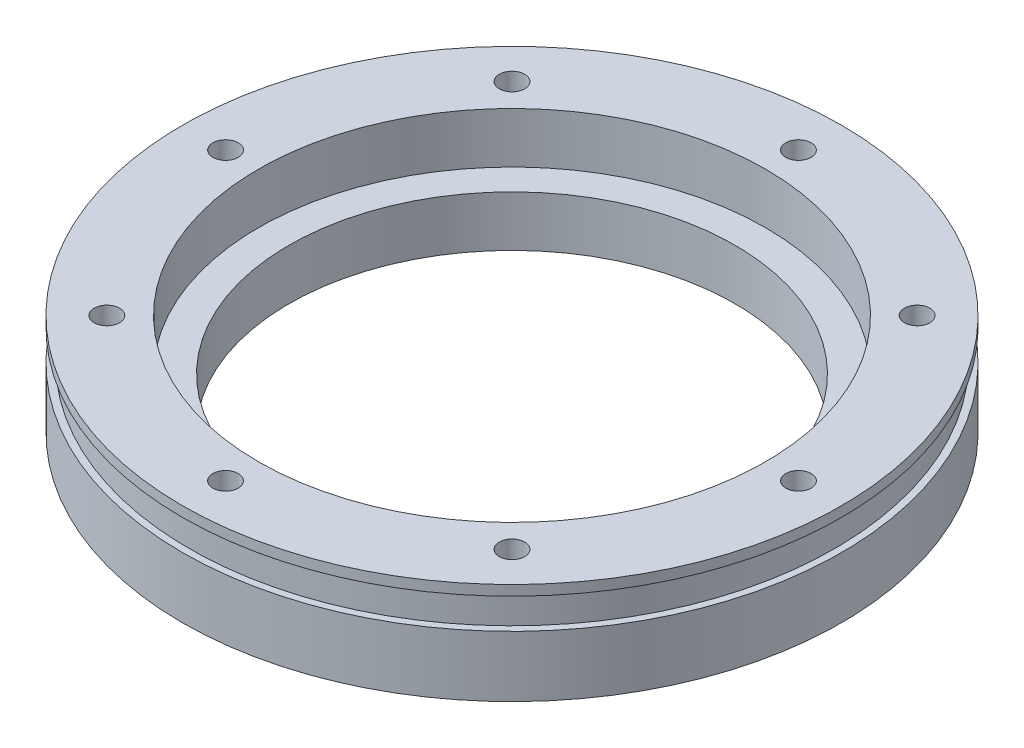
ISO-10303-21;
HEADER;
FILE_DESCRIPTION(('STEP AP214'),'2;1');
FILE_NAME('part.step','',(''),(''),'','','');
FILE_SCHEMA(('AUTOMOTIVE_DESIGN { 1 0 10303 214 1 1 1 1 }'));
ENDSEC;
DATA;
#1=APPLICATION_CONTEXT('core data for automotive mechanical design processes');
#2=APPLICATION_PROTOCOL_DEFINITION('international standard','automotive_design',2000,#1);
#3=PRODUCT_CONTEXT('',#1,'mechanical');
#4=PRODUCT('Part','Part','',(#3));
#5=PRODUCT_RELATED_PRODUCT_CATEGORY('part','',(#4));
#6=PRODUCT_DEFINITION_FORMATION('','',#4);
#7=PRODUCT_DEFINITION_CONTEXT('part definition',#1,'design');
#8=PRODUCT_DEFINITION('design','',#6,#7);
#9=PRODUCT_DEFINITION_SHAPE('','',#8);
#10=(LENGTH_UNIT() NAMED_UNIT(*) SI_UNIT(.MILLI.,.METRE.));
#11=(NAMED_UNIT(*) PLANE_ANGLE_UNIT() SI_UNIT($,.RADIAN.));
#12=(NAMED_UNIT(*) SI_UNIT($,.STERADIAN.) SOLID_ANGLE_UNIT());
#13=UNCERTAINTY_MEASURE_WITH_UNIT(LENGTH_MEASURE(1.E-05),#10,'distance_accuracy_value','');
#14=(GEOMETRIC_REPRESENTATION_CONTEXT(3) GLOBAL_UNCERTAINTY_ASSIGNED_CONTEXT((#13)) GLOBAL_UNIT_ASSIGNED_CONTEXT((#10,
#11,#12)) REPRESENTATION_CONTEXT('',''));
#15=CARTESIAN_POINT('',(0.,0.,0.));
#16=DIRECTION('',(0.,0.,1.));
#17=DIRECTION('',(1.,0.,0.));
#18=AXIS2_PLACEMENT_3D('',#15,#16,#17);
#19=CARTESIAN_POINT('',(0.,-10.,0.));
#20=DIRECTION('',(0.,1.,0.));
#21=DIRECTION('',(0.,0.,1.));
#22=AXIS2_PLACEMENT_3D('',#19,#20,#21);
#23=CYLINDRICAL_SURFACE('',#22,44.);
#24=CARTESIAN_POINT('',(0.,-10.,0.));
#25=DIRECTION('',(0.,1.,0.));
#26=DIRECTION('',(0.,0.,1.));
#27=AXIS2_PLACEMENT_3D('',#24,#25,#26);
#28=CIRCLE('',#27,44.);
#29=CARTESIAN_POINT('',(0.,-10.,44.));
#30=VERTEX_POINT('',#29);
#31=EDGE_CURVE('E59',#30,#30,#28,.T.);
#32=ORIENTED_EDGE('',*,*,#31,.F.);
#33=EDGE_LOOP('',(#32));
#34=FACE_BOUND('',#33,.T.);
#35=CARTESIAN_POINT('',(0.,0.,0.));
#36=DIRECTION('',(0.,1.,0.));
#37=DIRECTION('',(0.,0.,1.));
#38=AXIS2_PLACEMENT_3D('',#35,#36,#37);
#39=CIRCLE('',#38,44.);
#40=CARTESIAN_POINT('',(0.,0.,44.));
#41=VERTEX_POINT('',#40);
#42=EDGE_CURVE('E36',#41,#41,#39,.F.);
#43=ORIENTED_EDGE('',*,*,#42,.F.);
#44=EDGE_LOOP('',(#43));
#45=FACE_BOUND('',#44,.T.);
#46=ADVANCED_FACE('F32',(#34,#45),#23,.F.);
#47=CARTESIAN_POINT('',(0.,10.,0.));
#48=DIRECTION('',(0.,-1.,0.));
#49=DIRECTION('',(0.,0.,-1.));
#50=AXIS2_PLACEMENT_3D('',#47,#48,#49);
#51=CYLINDRICAL_SURFACE('',#50,63.66);
#52=CARTESIAN_POINT('',(0.,8.,0.));
#53=DIRECTION('',(0.,1.,0.));
#54=DIRECTION('',(0.,0.,1.));
#55=AXIS2_PLACEMENT_3D('',#52,#53,#54);
#56=CIRCLE('',#55,63.66);
#57=CARTESIAN_POINT('',(0.,8.,63.66));
#58=VERTEX_POINT('',#57);
#59=EDGE_CURVE('E40',#58,#58,#56,.T.);
#60=ORIENTED_EDGE('',*,*,#59,.F.);
#61=EDGE_LOOP('',(#60));
#62=FACE_BOUND('',#61,.T.);
#63=CARTESIAN_POINT('',(0.,2.,0.));
#64=DIRECTION('',(0.,-1.,0.));
#65=DIRECTION('',(0.,0.,-1.));
#66=AXIS2_PLACEMENT_3D('',#63,#64,#65);
#67=CIRCLE('',#66,63.66);
#68=CARTESIAN_POINT('',(0.,2.,-63.66));
#69=VERTEX_POINT('',#68);
#70=EDGE_CURVE('E10',#69,#69,#67,.T.);
#71=ORIENTED_EDGE('',*,*,#70,.F.);
#72=EDGE_LOOP('',(#71));
#73=FACE_BOUND('',#72,.T.);
#74=ADVANCED_FACE('F34',(#62,#73),#51,.T.);
#75=CARTESIAN_POINT('',(0.,8.,0.));
#76=DIRECTION('',(0.,1.,0.));
#77=DIRECTION('',(0.,0.,1.));
#78=AXIS2_PLACEMENT_3D('',#75,#76,#77);
#79=CYLINDRICAL_SURFACE('',#78,65.);
#80=CARTESIAN_POINT('',(0.,8.,0.));
#81=DIRECTION('',(0.,1.,0.));
#82=DIRECTION('',(0.,0.,1.));
#83=AXIS2_PLACEMENT_3D('',#80,#81,#82);
#84=CIRCLE('',#83,65.);
#85=CARTESIAN_POINT('',(0.,8.,65.));
#86=VERTEX_POINT('',#85);
#87=EDGE_CURVE('E44',#86,#86,#84,.T.);
#88=ORIENTED_EDGE('',*,*,#87,.T.);
#89=EDGE_LOOP('',(#88));
#90=FACE_BOUND('',#89,.T.);
#91=CARTESIAN_POINT('',(0.,10.,0.));
#92=DIRECTION('',(0.,1.,0.));
#93=DIRECTION('',(0.,0.,1.));
#94=AXIS2_PLACEMENT_3D('',#91,#92,#93);
#95=CIRCLE('',#94,65.);
#96=CARTESIAN_POINT('',(0.,10.,65.));
#97=VERTEX_POINT('',#96);
#98=EDGE_CURVE('E47',#97,#97,#95,.T.);
#99=ORIENTED_EDGE('',*,*,#98,.F.);
#100=EDGE_LOOP('',(#99));
#101=FACE_BOUND('',#100,.T.);
#102=ADVANCED_FACE('F127',(#90,#101),#79,.T.);
#103=CARTESIAN_POINT('',(0.,8.,0.));
#104=DIRECTION('',(0.,1.,0.));
#105=DIRECTION('',(0.,0.,1.));
#106=AXIS2_PLACEMENT_3D('',#103,#104,#105);
#107=PLANE('',#106);
#108=ORIENTED_EDGE('',*,*,#59,.T.);
#109=EDGE_LOOP('',(#108));
#110=FACE_BOUND('',#109,.T.);
#111=ORIENTED_EDGE('',*,*,#87,.F.);
#112=EDGE_LOOP('',(#111));
#113=FACE_BOUND('',#112,.T.);
#114=ADVANCED_FACE('F147',(#110,#113),#107,.F.);
#115=CARTESIAN_POINT('',(0.,10.,0.));
#116=DIRECTION('',(0.,1.,0.));
#117=DIRECTION('',(0.,0.,1.));
#118=AXIS2_PLACEMENT_3D('',#115,#116,#117);
#119=PLANE('',#118);
#120=CARTESIAN_POINT('',(0.,10.,0.));
#121=DIRECTION('',(0.,1.,0.));
#122=DIRECTION('',(0.,0.,1.));
#123=AXIS2_PLACEMENT_3D('',#120,#121,#122);
#124=CIRCLE('',#123,50.);
#125=CARTESIAN_POINT('',(0.,10.,50.));
#126=VERTEX_POINT('',#125);
#127=EDGE_CURVE('E109',#126,#126,#124,.T.);
#128=ORIENTED_EDGE('',*,*,#127,.F.);
#129=EDGE_LOOP('',(#128));
#130=FACE_BOUND('',#129,.T.);
#131=CARTESIAN_POINT('',(0.,10.,-56.5));
#132=DIRECTION('',(0.,1.,0.));
#133=DIRECTION('',(0.,0.,1.));
#134=AXIS2_PLACEMENT_3D('',#131,#132,#133);
#135=CIRCLE('',#134,2.5);
#136=CARTESIAN_POINT('',(0.,10.,-54.));
#137=VERTEX_POINT('',#136);
#138=EDGE_CURVE('E62',#137,#137,#135,.T.);
#139=ORIENTED_EDGE('',*,*,#138,.F.);
#140=EDGE_LOOP('',(#139));
#141=FACE_BOUND('',#140,.T.);
#142=CARTESIAN_POINT('',(-39.9515331370392,10.,-39.9515331370382));
#143=DIRECTION('',(0.,1.,0.));
#144=DIRECTION('',(0.,0.,1.));
#145=AXIS2_PLACEMENT_3D('',#142,#143,#144);
#146=CIRCLE('',#145,2.50000000000184);
#147=CARTESIAN_POINT('',(-39.9515331370392,10.,-37.4515331370364));
#148=VERTEX_POINT('',#147);
#149=EDGE_CURVE('E82',#148,#148,#146,.T.);
#150=ORIENTED_EDGE('',*,*,#149,.F.);
#151=EDGE_LOOP('',(#150));
#152=FACE_BOUND('',#151,.T.);
#153=CARTESIAN_POINT('',(-56.4999999999976,10.,2.40528024701915E-12));
#154=DIRECTION('',(0.,1.,0.));
#155=DIRECTION('',(0.,0.,1.));
#156=AXIS2_PLACEMENT_3D('',#153,#154,#155);
#157=CIRCLE('',#156,2.50000000000356);
#158=CARTESIAN_POINT('',(-56.4999999999976,10.,2.50000000000597));
#159=VERTEX_POINT('',#158);
#160=EDGE_CURVE('E88',#159,#159,#157,.T.);
#161=ORIENTED_EDGE('',*,*,#160,.F.);
#162=EDGE_LOOP('',(#161));
#163=FACE_BOUND('',#162,.T.);
#164=CARTESIAN_POINT('',(-39.9515331370358,10.,39.9515331370416));
#165=DIRECTION('',(0.,1.,0.));
#166=DIRECTION('',(0.,0.,1.));
#167=AXIS2_PLACEMENT_3D('',#164,#165,#166);
#168=CIRCLE('',#167,2.50000000000488);
#169=CARTESIAN_POINT('',(-39.9515331370358,10.,42.4515331370465));
#170=VERTEX_POINT('',#169);
#171=EDGE_CURVE('E94',#170,#170,#168,.T.);
#172=ORIENTED_EDGE('',*,*,#171,.F.);
#173=EDGE_LOOP('',(#172));
#174=FACE_BOUND('',#173,.T.);
#175=CARTESIAN_POINT('',(4.79672198520793E-12,10.,56.5));
#176=DIRECTION('',(0.,1.,0.));
#177=DIRECTION('',(0.,0.,1.));
#178=AXIS2_PLACEMENT_3D('',#175,#176,#177);
#179=CIRCLE('',#178,2.50000000000496);
#180=CARTESIAN_POINT('',(4.79672198520793E-12,10.,59.000000000005));
#181=VERTEX_POINT('',#180);
#182=EDGE_CURVE('E100',#181,#181,#179,.T.);
#183=ORIENTED_EDGE('',*,*,#182,.F.);
#184=EDGE_LOOP('',(#183));
#185=FACE_BOUND('',#184,.T.);
#186=CARTESIAN_POINT('',(39.9515331370406,10.,-39.9515331370416));
#187=DIRECTION('',(0.,1.,0.));
#188=DIRECTION('',(0.,0.,1.));
#189=AXIS2_PLACEMENT_3D('',#186,#187,#188);
#190=CIRCLE('',#189,2.50000000000027);
#191=CARTESIAN_POINT('',(39.9515331370406,10.,-37.4515331370414));
#192=VERTEX_POINT('',#191);
#193=EDGE_CURVE('E64',#192,#192,#190,.T.);
#194=ORIENTED_EDGE('',*,*,#193,.F.);
#195=EDGE_LOOP('',(#194));
#196=FACE_BOUND('',#195,.T.);
#197=CARTESIAN_POINT('',(56.5000000000024,10.,-2.39836099260397E-12));
#198=DIRECTION('',(0.,1.,0.));
#199=DIRECTION('',(0.,0.,1.));
#200=AXIS2_PLACEMENT_3D('',#197,#198,#199);
#201=CIRCLE('',#200,2.50000000000178);
#202=CARTESIAN_POINT('',(56.5000000000024,10.,2.49999999999938));
#203=VERTEX_POINT('',#202);
#204=EDGE_CURVE('E77',#203,#203,#201,.T.);
#205=ORIENTED_EDGE('',*,*,#204,.F.);
#206=EDGE_LOOP('',(#205));
#207=FACE_BOUND('',#206,.T.);
#208=CARTESIAN_POINT('',(39.951533137044,10.,39.9515331370382));
#209=DIRECTION('',(0.,1.,0.));
#210=DIRECTION('',(0.,0.,1.));
#211=AXIS2_PLACEMENT_3D('',#208,#209,#210);
#212=CIRCLE('',#211,2.50000000000371);
#213=CARTESIAN_POINT('',(39.951533137044,10.,42.4515331370419));
#214=VERTEX_POINT('',#213);
#215=EDGE_CURVE('E70',#214,#214,#212,.T.);
#216=ORIENTED_EDGE('',*,*,#215,.F.);
#217=EDGE_LOOP('',(#216));
#218=FACE_BOUND('',#217,.T.);
#219=ORIENTED_EDGE('',*,*,#98,.T.);
#220=EDGE_LOOP('',(#219));
#221=FACE_BOUND('',#220,.T.);
#222=ADVANCED_FACE('F145',(#130,#141,#152,#163,#174,#185,#196,#207,#218,#221),#119,.T.);
#223=CARTESIAN_POINT('',(0.,2.,0.));
#224=DIRECTION('',(0.,-1.,0.));
#225=DIRECTION('',(0.,0.,-1.));
#226=AXIS2_PLACEMENT_3D('',#223,#224,#225);
#227=CYLINDRICAL_SURFACE('',#226,65.);
#228=CARTESIAN_POINT('',(0.,2.,0.));
#229=DIRECTION('',(0.,-1.,0.));
#230=DIRECTION('',(0.,0.,-1.));
#231=AXIS2_PLACEMENT_3D('',#228,#229,#230);
#232=CIRCLE('',#231,65.);
#233=CARTESIAN_POINT('',(0.,2.,-65.));
#234=VERTEX_POINT('',#233);
#235=EDGE_CURVE('E50',#234,#234,#232,.T.);
#236=ORIENTED_EDGE('',*,*,#235,.T.);
#237=EDGE_LOOP('',(#236));
#238=FACE_BOUND('',#237,.T.);
#239=CARTESIAN_POINT('',(0.,-10.,0.));
#240=DIRECTION('',(0.,-1.,0.));
#241=DIRECTION('',(0.,0.,-1.));
#242=AXIS2_PLACEMENT_3D('',#239,#240,#241);
#243=CIRCLE('',#242,65.);
#244=CARTESIAN_POINT('',(0.,-10.,-65.));
#245=VERTEX_POINT('',#244);
#246=EDGE_CURVE('E55',#245,#245,#243,.T.);
#247=ORIENTED_EDGE('',*,*,#246,.F.);
#248=EDGE_LOOP('',(#247));
#249=FACE_BOUND('',#248,.T.);
#250=ADVANCED_FACE('F142',(#238,#249),#227,.T.);
#251=CARTESIAN_POINT('',(0.,2.,0.));
#252=DIRECTION('',(0.,-1.,0.));
#253=DIRECTION('',(0.,0.,-1.));
#254=AXIS2_PLACEMENT_3D('',#251,#252,#253);
#255=PLANE('',#254);
#256=ORIENTED_EDGE('',*,*,#70,.T.);
#257=EDGE_LOOP('',(#256));
#258=FACE_BOUND('',#257,.T.);
#259=ORIENTED_EDGE('',*,*,#235,.F.);
#260=EDGE_LOOP('',(#259));
#261=FACE_BOUND('',#260,.T.);
#262=ADVANCED_FACE('F138',(#258,#261),#255,.F.);
#263=CARTESIAN_POINT('',(0.,-10.,0.));
#264=DIRECTION('',(0.,-1.,0.));
#265=DIRECTION('',(0.,0.,-1.));
#266=AXIS2_PLACEMENT_3D('',#263,#264,#265);
#267=PLANE('',#266);
#268=CARTESIAN_POINT('',(0.,-10.,-56.5));
#269=DIRECTION('',(0.,1.,0.));
#270=DIRECTION('',(0.,0.,1.));
#271=AXIS2_PLACEMENT_3D('',#268,#269,#270);
#272=CIRCLE('',#271,2.5);
#273=CARTESIAN_POINT('',(0.,-10.,-54.));
#274=VERTEX_POINT('',#273);
#275=EDGE_CURVE('E58',#274,#274,#272,.T.);
#276=ORIENTED_EDGE('',*,*,#275,.T.);
#277=EDGE_LOOP('',(#276));
#278=FACE_BOUND('',#277,.T.);
#279=CARTESIAN_POINT('',(-39.9515331370392,-10.,-39.9515331370382));
#280=DIRECTION('',(0.,1.,0.));
#281=DIRECTION('',(0.,0.,1.));
#282=AXIS2_PLACEMENT_3D('',#279,#280,#281);
#283=CIRCLE('',#282,2.50000000000184);
#284=CARTESIAN_POINT('',(-39.9515331370392,-10.,-37.4515331370364));
#285=VERTEX_POINT('',#284);
#286=EDGE_CURVE('E85',#285,#285,#283,.T.);
#287=ORIENTED_EDGE('',*,*,#286,.T.);
#288=EDGE_LOOP('',(#287));
#289=FACE_BOUND('',#288,.T.);
#290=CARTESIAN_POINT('',(-56.4999999999976,-10.,2.40528024701915E-12));
#291=DIRECTION('',(0.,1.,0.));
#292=DIRECTION('',(0.,0.,1.));
#293=AXIS2_PLACEMENT_3D('',#290,#291,#292);
#294=CIRCLE('',#293,2.50000000000356);
#295=CARTESIAN_POINT('',(-56.4999999999976,-10.,2.50000000000597));
#296=VERTEX_POINT('',#295);
#297=EDGE_CURVE('E91',#296,#296,#294,.T.);
#298=ORIENTED_EDGE('',*,*,#297,.T.);
#299=EDGE_LOOP('',(#298));
#300=FACE_BOUND('',#299,.T.);
#301=CARTESIAN_POINT('',(-39.9515331370358,-10.,39.9515331370416));
#302=DIRECTION('',(0.,1.,0.));
#303=DIRECTION('',(0.,0.,1.));
#304=AXIS2_PLACEMENT_3D('',#301,#302,#303);
#305=CIRCLE('',#304,2.50000000000488);
#306=CARTESIAN_POINT('',(-39.9515331370358,-10.,42.4515331370465));
#307=VERTEX_POINT('',#306);
#308=EDGE_CURVE('E97',#307,#307,#305,.T.);
#309=ORIENTED_EDGE('',*,*,#308,.T.);
#310=EDGE_LOOP('',(#309));
#311=FACE_BOUND('',#310,.T.);
#312=CARTESIAN_POINT('',(4.79672198520793E-12,-10.,56.5));
#313=DIRECTION('',(0.,1.,0.));
#314=DIRECTION('',(0.,0.,1.));
#315=AXIS2_PLACEMENT_3D('',#312,#313,#314);
#316=CIRCLE('',#315,2.50000000000496);
#317=CARTESIAN_POINT('',(4.79672198520793E-12,-10.,59.000000000005));
#318=VERTEX_POINT('',#317);
#319=EDGE_CURVE('E74',#318,#318,#316,.T.);
#320=ORIENTED_EDGE('',*,*,#319,.T.);
#321=EDGE_LOOP('',(#320));
#322=FACE_BOUND('',#321,.T.);
#323=CARTESIAN_POINT('',(39.9515331370406,-10.,-39.9515331370416));
#324=DIRECTION('',(0.,1.,0.));
#325=DIRECTION('',(0.,0.,1.));
#326=AXIS2_PLACEMENT_3D('',#323,#324,#325);
#327=CIRCLE('',#326,2.50000000000027);
#328=CARTESIAN_POINT('',(39.9515331370406,-10.,-37.4515331370414));
#329=VERTEX_POINT('',#328);
#330=EDGE_CURVE('E63',#329,#329,#327,.T.);
#331=ORIENTED_EDGE('',*,*,#330,.T.);
#332=EDGE_LOOP('',(#331));
#333=FACE_BOUND('',#332,.T.);
#334=ORIENTED_EDGE('',*,*,#31,.T.);
#335=EDGE_LOOP('',(#334));
#336=FACE_BOUND('',#335,.T.);
#337=CARTESIAN_POINT('',(56.5000000000024,-10.,-2.39836099260397E-12));
#338=DIRECTION('',(0.,1.,0.));
#339=DIRECTION('',(0.,0.,1.));
#340=AXIS2_PLACEMENT_3D('',#337,#338,#339);
#341=CIRCLE('',#340,2.50000000000178);
#342=CARTESIAN_POINT('',(56.5000000000024,-10.,2.49999999999938));
#343=VERTEX_POINT('',#342);
#344=EDGE_CURVE('E67',#343,#343,#341,.T.);
#345=ORIENTED_EDGE('',*,*,#344,.T.);
#346=EDGE_LOOP('',(#345));
#347=FACE_BOUND('',#346,.T.);
#348=CARTESIAN_POINT('',(39.951533137044,-10.,39.9515331370382));
#349=DIRECTION('',(0.,1.,0.));
#350=DIRECTION('',(0.,0.,1.));
#351=AXIS2_PLACEMENT_3D('',#348,#349,#350);
#352=CIRCLE('',#351,2.50000000000371);
#353=CARTESIAN_POINT('',(39.951533137044,-10.,42.4515331370419));
#354=VERTEX_POINT('',#353);
#355=EDGE_CURVE('E73',#354,#354,#352,.T.);
#356=ORIENTED_EDGE('',*,*,#355,.T.);
#357=EDGE_LOOP('',(#356));
#358=FACE_BOUND('',#357,.T.);
#359=ORIENTED_EDGE('',*,*,#246,.T.);
#360=EDGE_LOOP('',(#359));
#361=FACE_BOUND('',#360,.T.);
#362=ADVANCED_FACE('F134',(#278,#289,#300,#311,#322,#333,#336,#347,#358,#361),#267,.T.);
#363=CARTESIAN_POINT('',(39.951533137044,-10.,39.9515331370382));
#364=DIRECTION('',(0.,1.,0.));
#365=DIRECTION('',(0.,0.,1.));
#366=AXIS2_PLACEMENT_3D('',#363,#364,#365);
#367=CYLINDRICAL_SURFACE('',#366,2.50000000000371);
#368=ORIENTED_EDGE('',*,*,#355,.F.);
#369=EDGE_LOOP('',(#368));
#370=FACE_BOUND('',#369,.T.);
#371=ORIENTED_EDGE('',*,*,#215,.T.);
#372=EDGE_LOOP('',(#371));
#373=FACE_BOUND('',#372,.T.);
#374=ADVANCED_FACE('F137',(#370,#373),#367,.F.);
#375=CARTESIAN_POINT('',(56.5000000000024,-10.,-2.39836099260397E-12));
#376=DIRECTION('',(0.,1.,0.));
#377=DIRECTION('',(0.,0.,1.));
#378=AXIS2_PLACEMENT_3D('',#375,#376,#377);
#379=CYLINDRICAL_SURFACE('',#378,2.50000000000178);
#380=ORIENTED_EDGE('',*,*,#344,.F.);
#381=EDGE_LOOP('',(#380));
#382=FACE_BOUND('',#381,.T.);
#383=ORIENTED_EDGE('',*,*,#204,.T.);
#384=EDGE_LOOP('',(#383));
#385=FACE_BOUND('',#384,.T.);
#386=ADVANCED_FACE('F179',(#382,#385),#379,.F.);
#387=CARTESIAN_POINT('',(39.9515331370406,-10.,-39.9515331370416));
#388=DIRECTION('',(0.,1.,0.));
#389=DIRECTION('',(0.,0.,1.));
#390=AXIS2_PLACEMENT_3D('',#387,#388,#389);
#391=CYLINDRICAL_SURFACE('',#390,2.50000000000027);
#392=ORIENTED_EDGE('',*,*,#330,.F.);
#393=EDGE_LOOP('',(#392));
#394=FACE_BOUND('',#393,.T.);
#395=ORIENTED_EDGE('',*,*,#193,.T.);
#396=EDGE_LOOP('',(#395));
#397=FACE_BOUND('',#396,.T.);
#398=ADVANCED_FACE('F132',(#394,#397),#391,.F.);
#399=CARTESIAN_POINT('',(4.79672198520793E-12,-10.,56.5));
#400=DIRECTION('',(0.,1.,0.));
#401=DIRECTION('',(0.,0.,1.));
#402=AXIS2_PLACEMENT_3D('',#399,#400,#401);
#403=CYLINDRICAL_SURFACE('',#402,2.50000000000496);
#404=ORIENTED_EDGE('',*,*,#319,.F.);
#405=EDGE_LOOP('',(#404));
#406=FACE_BOUND('',#405,.T.);
#407=ORIENTED_EDGE('',*,*,#182,.T.);
#408=EDGE_LOOP('',(#407));
#409=FACE_BOUND('',#408,.T.);
#410=ADVANCED_FACE('F200',(#406,#409),#403,.F.);
#411=CARTESIAN_POINT('',(-39.9515331370358,-10.,39.9515331370416));
#412=DIRECTION('',(0.,1.,0.));
#413=DIRECTION('',(0.,0.,1.));
#414=AXIS2_PLACEMENT_3D('',#411,#412,#413);
#415=CYLINDRICAL_SURFACE('',#414,2.50000000000488);
#416=ORIENTED_EDGE('',*,*,#308,.F.);
#417=EDGE_LOOP('',(#416));
#418=FACE_BOUND('',#417,.T.);
#419=ORIENTED_EDGE('',*,*,#171,.T.);
#420=EDGE_LOOP('',(#419));
#421=FACE_BOUND('',#420,.T.);
#422=ADVANCED_FACE('F196',(#418,#421),#415,.F.);
#423=CARTESIAN_POINT('',(-56.4999999999976,-10.,2.40528024701915E-12));
#424=DIRECTION('',(0.,1.,0.));
#425=DIRECTION('',(0.,0.,1.));
#426=AXIS2_PLACEMENT_3D('',#423,#424,#425);
#427=CYLINDRICAL_SURFACE('',#426,2.50000000000356);
#428=ORIENTED_EDGE('',*,*,#297,.F.);
#429=EDGE_LOOP('',(#428));
#430=FACE_BOUND('',#429,.T.);
#431=ORIENTED_EDGE('',*,*,#160,.T.);
#432=EDGE_LOOP('',(#431));
#433=FACE_BOUND('',#432,.T.);
#434=ADVANCED_FACE('F192',(#430,#433),#427,.F.);
#435=CARTESIAN_POINT('',(-39.9515331370392,-10.,-39.9515331370382));
#436=DIRECTION('',(0.,1.,0.));
#437=DIRECTION('',(0.,0.,1.));
#438=AXIS2_PLACEMENT_3D('',#435,#436,#437);
#439=CYLINDRICAL_SURFACE('',#438,2.50000000000184);
#440=ORIENTED_EDGE('',*,*,#286,.F.);
#441=EDGE_LOOP('',(#440));
#442=FACE_BOUND('',#441,.T.);
#443=ORIENTED_EDGE('',*,*,#149,.T.);
#444=EDGE_LOOP('',(#443));
#445=FACE_BOUND('',#444,.T.);
#446=ADVANCED_FACE('F188',(#442,#445),#439,.F.);
#447=CARTESIAN_POINT('',(0.,-10.,-56.5));
#448=DIRECTION('',(0.,1.,0.));
#449=DIRECTION('',(0.,0.,1.));
#450=AXIS2_PLACEMENT_3D('',#447,#448,#449);
#451=CYLINDRICAL_SURFACE('',#450,2.5);
#452=ORIENTED_EDGE('',*,*,#275,.F.);
#453=EDGE_LOOP('',(#452));
#454=FACE_BOUND('',#453,.T.);
#455=ORIENTED_EDGE('',*,*,#138,.T.);
#456=EDGE_LOOP('',(#455));
#457=FACE_BOUND('',#456,.T.);
#458=ADVANCED_FACE('F191',(#454,#457),#451,.F.);
#459=CARTESIAN_POINT('',(0.,0.,0.));
#460=DIRECTION('',(0.,1.,0.));
#461=DIRECTION('',(0.,0.,1.));
#462=AXIS2_PLACEMENT_3D('',#459,#460,#461);
#463=PLANE('',#462);
#464=CARTESIAN_POINT('',(0.,0.,0.));
#465=DIRECTION('',(0.,1.,0.));
#466=DIRECTION('',(0.,0.,1.));
#467=AXIS2_PLACEMENT_3D('',#464,#465,#466);
#468=CIRCLE('',#467,50.);
#469=CARTESIAN_POINT('',(0.,0.,50.));
#470=VERTEX_POINT('',#469);
#471=EDGE_CURVE('E112',#470,#470,#468,.T.);
#472=ORIENTED_EDGE('',*,*,#471,.T.);
#473=EDGE_LOOP('',(#472));
#474=FACE_BOUND('',#473,.T.);
#475=ORIENTED_EDGE('',*,*,#42,.T.);
#476=EDGE_LOOP('',(#475));
#477=FACE_BOUND('',#476,.T.);
#478=ADVANCED_FACE('F119',(#474,#477),#463,.T.);
#479=CARTESIAN_POINT('',(0.,0.,0.));
#480=DIRECTION('',(0.,1.,0.));
#481=DIRECTION('',(0.,0.,1.));
#482=AXIS2_PLACEMENT_3D('',#479,#480,#481);
#483=CYLINDRICAL_SURFACE('',#482,50.);
#484=ORIENTED_EDGE('',*,*,#471,.F.);
#485=EDGE_LOOP('',(#484));
#486=FACE_BOUND('',#485,.T.);
#487=ORIENTED_EDGE('',*,*,#127,.T.);
#488=EDGE_LOOP('',(#487));
#489=FACE_BOUND('',#488,.T.);
#490=ADVANCED_FACE('F208',(#486,#489),#483,.F.);
#491=CLOSED_SHELL('',(#46,#74,#102,#114,#222,#250,#262,#362,#374,#386,#398,#410,#422,#434,#446,
#458,#478,#490));
#492=MANIFOLD_SOLID_BREP('B2',#491);
#493=ADVANCED_BREP_SHAPE_REPRESENTATION('',(#18,#492),#14);
#494=SHAPE_DEFINITION_REPRESENTATION(#9,#493);
ENDSEC;
END-ISO-10303-21;
